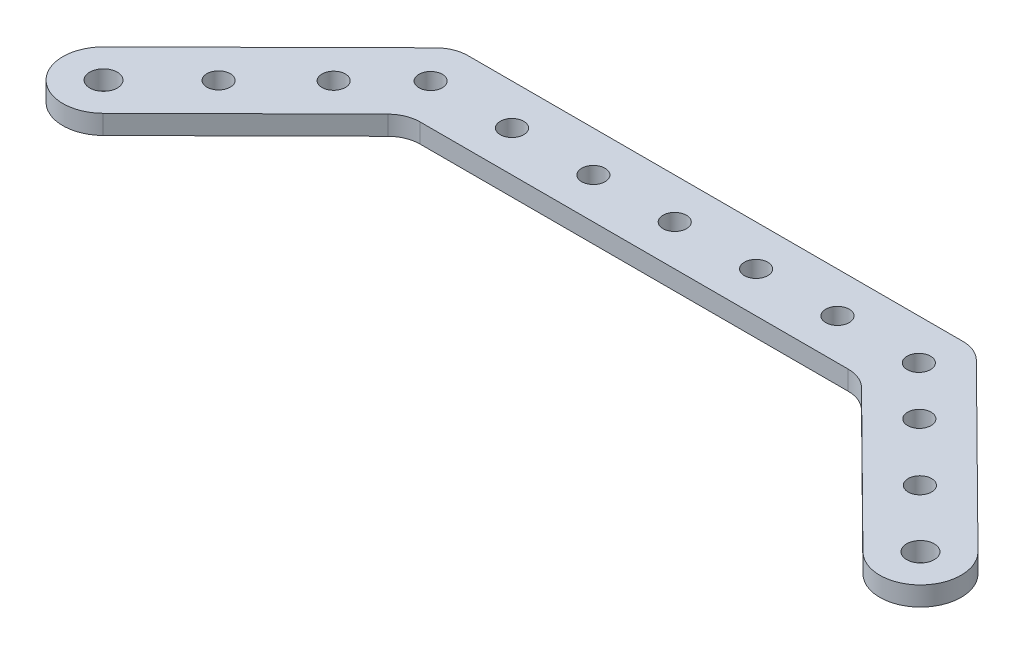
ISO-10303-21;
HEADER;
FILE_DESCRIPTION(('STEP AP214'),'2;1');
FILE_NAME('part.step','',(''),(''),'','','');
FILE_SCHEMA(('AUTOMOTIVE_DESIGN { 1 0 10303 214 1 1 1 1 }'));
ENDSEC;
DATA;
#1=APPLICATION_CONTEXT('core data for automotive mechanical design processes');
#2=APPLICATION_PROTOCOL_DEFINITION('international standard','automotive_design',2000,#1);
#3=PRODUCT_CONTEXT('',#1,'mechanical');
#4=PRODUCT('Part','Part','',(#3));
#5=PRODUCT_RELATED_PRODUCT_CATEGORY('part','',(#4));
#6=PRODUCT_DEFINITION_FORMATION('','',#4);
#7=PRODUCT_DEFINITION_CONTEXT('part definition',#1,'design');
#8=PRODUCT_DEFINITION('design','',#6,#7);
#9=PRODUCT_DEFINITION_SHAPE('','',#8);
#10=(LENGTH_UNIT() NAMED_UNIT(*) SI_UNIT(.MILLI.,.METRE.));
#11=(NAMED_UNIT(*) PLANE_ANGLE_UNIT() SI_UNIT($,.RADIAN.));
#12=(NAMED_UNIT(*) SI_UNIT($,.STERADIAN.) SOLID_ANGLE_UNIT());
#13=UNCERTAINTY_MEASURE_WITH_UNIT(LENGTH_MEASURE(1.E-05),#10,'distance_accuracy_value','');
#14=(GEOMETRIC_REPRESENTATION_CONTEXT(3) GLOBAL_UNCERTAINTY_ASSIGNED_CONTEXT((#13)) GLOBAL_UNIT_ASSIGNED_CONTEXT((#10,
#11,#12)) REPRESENTATION_CONTEXT('',''));
#15=CARTESIAN_POINT('',(0.,0.,0.));
#16=DIRECTION('',(0.,0.,1.));
#17=DIRECTION('',(1.,0.,0.));
#18=AXIS2_PLACEMENT_3D('',#15,#16,#17);
#19=CARTESIAN_POINT('',(70.104,3.,-19.05));
#20=DIRECTION('',(0.,0.,1.));
#21=DIRECTION('',(1.,0.,0.));
#22=AXIS2_PLACEMENT_3D('',#19,#20,#21);
#23=PLANE('',#22);
#24=DIRECTION('',(-1.,0.,0.));
#25=VECTOR('',#24,1.);
#26=CARTESIAN_POINT('',(70.104,0.,-19.05));
#27=LINE('',#26,#25);
#28=CARTESIAN_POINT('',(38.6223538191422,0.,-19.05));
#29=VERTEX_POINT('',#28);
#30=CARTESIAN_POINT('',(-38.6223538191423,0.,-19.05));
#31=VERTEX_POINT('',#30);
#32=EDGE_CURVE('E160',#29,#31,#27,.T.);
#33=ORIENTED_EDGE('',*,*,#32,.T.);
#34=DIRECTION('',(0.,1.,0.));
#35=VECTOR('',#34,1.);
#36=CARTESIAN_POINT('',(-38.6223538191423,3.,-19.05));
#37=LINE('',#36,#35);
#38=CARTESIAN_POINT('',(-38.6223538191423,3.,-19.05));
#39=VERTEX_POINT('',#38);
#40=EDGE_CURVE('E167',#31,#39,#37,.T.);
#41=ORIENTED_EDGE('',*,*,#40,.T.);
#42=DIRECTION('',(-1.,0.,0.));
#43=VECTOR('',#42,1.);
#44=CARTESIAN_POINT('',(70.104,3.,-19.05));
#45=LINE('',#44,#43);
#46=CARTESIAN_POINT('',(38.6223538191422,3.,-19.05));
#47=VERTEX_POINT('',#46);
#48=EDGE_CURVE('E144',#47,#39,#45,.T.);
#49=ORIENTED_EDGE('',*,*,#48,.F.);
#50=DIRECTION('',(0.,1.,0.));
#51=VECTOR('',#50,1.);
#52=CARTESIAN_POINT('',(38.6223538191422,0.,-19.05));
#53=LINE('',#52,#51);
#54=EDGE_CURVE('E165',#47,#29,#53,.F.);
#55=ORIENTED_EDGE('',*,*,#54,.T.);
#56=EDGE_LOOP('',(#33,#41,#49,#55));
#57=FACE_BOUND('',#56,.T.);
#58=ADVANCED_FACE('F35',(#57),#23,.F.);
#59=CARTESIAN_POINT('',(0.,3.,0.));
#60=DIRECTION('',(0.,1.,0.));
#61=DIRECTION('',(0.,0.,1.));
#62=AXIS2_PLACEMENT_3D('',#59,#60,#61);
#63=PLANE('',#62);
#64=CARTESIAN_POINT('',(-54.7291776776711,3.,3.76453235412978));
#65=DIRECTION('',(0.,1.,0.));
#66=DIRECTION('',(0.,0.,1.));
#67=AXIS2_PLACEMENT_3D('',#64,#65,#66);
#68=CIRCLE('',#67,1.82879999999999);
#69=CARTESIAN_POINT('',(-54.7291776776711,3.,5.59333235412977));
#70=VERTEX_POINT('',#69);
#71=EDGE_CURVE('E450',#70,#70,#68,.T.);
#72=ORIENTED_EDGE('',*,*,#71,.F.);
#73=EDGE_LOOP('',(#72));
#74=FACE_BOUND('',#73,.T.);
#75=CARTESIAN_POINT('',(-45.7043553553422,3.,-5.17093529174044));
#76=DIRECTION('',(0.,1.,0.));
#77=DIRECTION('',(0.,0.,1.));
#78=AXIS2_PLACEMENT_3D('',#75,#76,#77);
#79=CIRCLE('',#78,1.82879999999998);
#80=CARTESIAN_POINT('',(-45.7043553553422,3.,-3.34213529174046));
#81=VERTEX_POINT('',#80);
#82=EDGE_CURVE('E446',#81,#81,#79,.T.);
#83=ORIENTED_EDGE('',*,*,#82,.F.);
#84=EDGE_LOOP('',(#83));
#85=FACE_BOUND('',#84,.T.);
#86=CARTESIAN_POINT('',(-38.1,3.,-12.7));
#87=DIRECTION('',(0.,1.,0.));
#88=DIRECTION('',(0.,0.,1.));
#89=AXIS2_PLACEMENT_3D('',#86,#87,#88);
#90=CIRCLE('',#89,1.82879999999998);
#91=CARTESIAN_POINT('',(-38.1,3.,-10.8712));
#92=VERTEX_POINT('',#91);
#93=EDGE_CURVE('E442',#92,#92,#90,.T.);
#94=ORIENTED_EDGE('',*,*,#93,.F.);
#95=EDGE_LOOP('',(#94));
#96=FACE_BOUND('',#95,.T.);
#97=CARTESIAN_POINT('',(0.,3.,-12.7));
#98=DIRECTION('',(0.,1.,0.));
#99=DIRECTION('',(0.,0.,1.));
#100=AXIS2_PLACEMENT_3D('',#97,#98,#99);
#101=CIRCLE('',#100,1.82879999999999);
#102=CARTESIAN_POINT('',(0.,3.,-10.8712));
#103=VERTEX_POINT('',#102);
#104=EDGE_CURVE('E438',#103,#103,#101,.T.);
#105=ORIENTED_EDGE('',*,*,#104,.F.);
#106=EDGE_LOOP('',(#105));
#107=FACE_BOUND('',#106,.T.);
#108=CARTESIAN_POINT('',(38.1,3.,-12.7));
#109=DIRECTION('',(0.,1.,0.));
#110=DIRECTION('',(0.,0.,1.));
#111=AXIS2_PLACEMENT_3D('',#108,#109,#110);
#112=CIRCLE('',#111,1.82879999999998);
#113=CARTESIAN_POINT('',(38.1,3.,-10.8712));
#114=VERTEX_POINT('',#113);
#115=EDGE_CURVE('E434',#114,#114,#112,.T.);
#116=ORIENTED_EDGE('',*,*,#115,.F.);
#117=EDGE_LOOP('',(#116));
#118=FACE_BOUND('',#117,.T.);
#119=CARTESIAN_POINT('',(45.7043553553422,3.,-5.17093529174044));
#120=DIRECTION('',(0.,1.,0.));
#121=DIRECTION('',(0.,0.,1.));
#122=AXIS2_PLACEMENT_3D('',#119,#120,#121);
#123=CIRCLE('',#122,1.82879999999998);
#124=CARTESIAN_POINT('',(45.7043553553422,3.,-3.34213529174046));
#125=VERTEX_POINT('',#124);
#126=EDGE_CURVE('E430',#125,#125,#123,.T.);
#127=ORIENTED_EDGE('',*,*,#126,.F.);
#128=EDGE_LOOP('',(#127));
#129=FACE_BOUND('',#128,.T.);
#130=CARTESIAN_POINT('',(54.7291776776711,3.,3.76453235412978));
#131=DIRECTION('',(0.,1.,0.));
#132=DIRECTION('',(0.,0.,1.));
#133=AXIS2_PLACEMENT_3D('',#130,#131,#132);
#134=CIRCLE('',#133,1.82879999999999);
#135=CARTESIAN_POINT('',(54.7291776776711,3.,5.59333235412977));
#136=VERTEX_POINT('',#135);
#137=EDGE_CURVE('E426',#136,#136,#134,.T.);
#138=ORIENTED_EDGE('',*,*,#137,.F.);
#139=EDGE_LOOP('',(#138));
#140=FACE_BOUND('',#139,.T.);
#141=CARTESIAN_POINT('',(-25.4,3.,-12.7));
#142=DIRECTION('',(0.,1.,0.));
#143=DIRECTION('',(0.,0.,1.));
#144=AXIS2_PLACEMENT_3D('',#141,#142,#143);
#145=CIRCLE('',#144,1.82879999999999);
#146=CARTESIAN_POINT('',(-25.4,3.,-10.8712));
#147=VERTEX_POINT('',#146);
#148=EDGE_CURVE('E422',#147,#147,#145,.T.);
#149=ORIENTED_EDGE('',*,*,#148,.F.);
#150=EDGE_LOOP('',(#149));
#151=FACE_BOUND('',#150,.T.);
#152=CARTESIAN_POINT('',(-12.7,3.,-12.7));
#153=DIRECTION('',(0.,1.,0.));
#154=DIRECTION('',(0.,0.,1.));
#155=AXIS2_PLACEMENT_3D('',#152,#153,#154);
#156=CIRCLE('',#155,1.82879999999999);
#157=CARTESIAN_POINT('',(-12.7,3.,-10.8712));
#158=VERTEX_POINT('',#157);
#159=EDGE_CURVE('E418',#158,#158,#156,.T.);
#160=ORIENTED_EDGE('',*,*,#159,.F.);
#161=EDGE_LOOP('',(#160));
#162=FACE_BOUND('',#161,.T.);
#163=CARTESIAN_POINT('',(12.7,3.,-12.7));
#164=DIRECTION('',(0.,1.,0.));
#165=DIRECTION('',(0.,0.,1.));
#166=AXIS2_PLACEMENT_3D('',#163,#164,#165);
#167=CIRCLE('',#166,1.82879999999999);
#168=CARTESIAN_POINT('',(12.7,3.,-10.8712));
#169=VERTEX_POINT('',#168);
#170=EDGE_CURVE('E414',#169,#169,#167,.T.);
#171=ORIENTED_EDGE('',*,*,#170,.F.);
#172=EDGE_LOOP('',(#171));
#173=FACE_BOUND('',#172,.T.);
#174=CARTESIAN_POINT('',(25.4,3.,-12.7));
#175=DIRECTION('',(0.,1.,0.));
#176=DIRECTION('',(0.,0.,1.));
#177=AXIS2_PLACEMENT_3D('',#174,#175,#176);
#178=CIRCLE('',#177,1.82879999999999);
#179=CARTESIAN_POINT('',(25.4,3.,-10.8712));
#180=VERTEX_POINT('',#179);
#181=EDGE_CURVE('E410',#180,#180,#178,.T.);
#182=ORIENTED_EDGE('',*,*,#181,.F.);
#183=EDGE_LOOP('',(#182));
#184=FACE_BOUND('',#183,.T.);
#185=CARTESIAN_POINT('',(-63.754,3.,12.7));
#186=DIRECTION('',(0.,1.,0.));
#187=DIRECTION('',(0.,0.,1.));
#188=AXIS2_PLACEMENT_3D('',#185,#186,#187);
#189=CIRCLE('',#188,2.15264999999999);
#190=CARTESIAN_POINT('',(-63.754,3.,14.85265));
#191=VERTEX_POINT('',#190);
#192=EDGE_CURVE('E404',#191,#191,#189,.T.);
#193=ORIENTED_EDGE('',*,*,#192,.F.);
#194=EDGE_LOOP('',(#193));
#195=FACE_BOUND('',#194,.T.);
#196=CARTESIAN_POINT('',(63.754,3.,12.7));
#197=DIRECTION('',(0.,1.,0.));
#198=DIRECTION('',(0.,0.,1.));
#199=AXIS2_PLACEMENT_3D('',#196,#197,#198);
#200=CIRCLE('',#199,2.15264999999999);
#201=CARTESIAN_POINT('',(63.754,3.,14.85265));
#202=VERTEX_POINT('',#201);
#203=EDGE_CURVE('E400',#202,#202,#200,.T.);
#204=ORIENTED_EDGE('',*,*,#203,.F.);
#205=EDGE_LOOP('',(#204));
#206=FACE_BOUND('',#205,.T.);
#207=ORIENTED_EDGE('',*,*,#48,.T.);
#208=CARTESIAN_POINT('',(-38.6223538191423,3.,-13.97));
#209=DIRECTION('',(0.,1.,0.));
#210=DIRECTION('',(0.,0.,1.));
#211=AXIS2_PLACEMENT_3D('',#208,#209,#210);
#212=CIRCLE('',#211,5.08);
#213=CARTESIAN_POINT('',(-42.1965408774903,3.,-17.5799289289316));
#214=VERTEX_POINT('',#213);
#215=EDGE_CURVE('E172',#39,#214,#212,.T.);
#216=ORIENTED_EDGE('',*,*,#215,.T.);
#217=DIRECTION('',(-0.710615930892041,0.,0.703580129596081));
#218=VECTOR('',#217,1.);
#219=CARTESIAN_POINT('',(-40.7117690957112,3.,-19.05));
#220=LINE('',#219,#218);
#221=CARTESIAN_POINT('',(-68.2217338229351,3.,8.18758883883555));
#222=VERTEX_POINT('',#221);
#223=EDGE_CURVE('E214',#214,#222,#220,.T.);
#224=ORIENTED_EDGE('',*,*,#223,.T.);
#225=CARTESIAN_POINT('',(-63.754,3.,12.7));
#226=DIRECTION('',(0.,1.,0.));
#227=DIRECTION('',(0.,0.,1.));
#228=AXIS2_PLACEMENT_3D('',#225,#226,#227);
#229=CIRCLE('',#228,6.34999999999999);
#230=CARTESIAN_POINT('',(-59.2862661770649,3.,17.2124111611645));
#231=VERTEX_POINT('',#230);
#232=EDGE_CURVE('E225',#222,#231,#229,.T.);
#233=ORIENTED_EDGE('',*,*,#232,.T.);
#234=DIRECTION('',(0.710615930892041,0.,-0.703580129596081));
#235=VECTOR('',#234,1.);
#236=CARTESIAN_POINT('',(-59.2862661770649,3.,17.2124111611645));
#237=LINE('',#236,#235);
#238=CARTESIAN_POINT('',(-36.9730026860679,3.,-4.87992892893158));
#239=VERTEX_POINT('',#238);
#240=EDGE_CURVE('E201',#231,#239,#237,.T.);
#241=ORIENTED_EDGE('',*,*,#240,.T.);
#242=CARTESIAN_POINT('',(-33.3988156277198,3.,-1.27000000000001));
#243=DIRECTION('',(0.,1.,0.));
#244=DIRECTION('',(0.,0.,1.));
#245=AXIS2_PLACEMENT_3D('',#242,#243,#244);
#246=CIRCLE('',#245,5.08);
#247=CARTESIAN_POINT('',(-33.3988156277198,3.,-6.35000000000001));
#248=VERTEX_POINT('',#247);
#249=EDGE_CURVE('E43',#239,#248,#246,.F.);
#250=ORIENTED_EDGE('',*,*,#249,.T.);
#251=DIRECTION('',(1.,0.,0.));
#252=VECTOR('',#251,1.);
#253=CARTESIAN_POINT('',(-35.4882309042888,3.,-6.35000000000001));
#254=LINE('',#253,#252);
#255=CARTESIAN_POINT('',(33.3988156277198,3.,-6.35000000000001));
#256=VERTEX_POINT('',#255);
#257=EDGE_CURVE('E199',#248,#256,#254,.T.);
#258=ORIENTED_EDGE('',*,*,#257,.T.);
#259=CARTESIAN_POINT('',(33.3988156277198,3.,-1.27000000000001));
#260=DIRECTION('',(0.,1.,0.));
#261=DIRECTION('',(0.,0.,1.));
#262=AXIS2_PLACEMENT_3D('',#259,#260,#261);
#263=CIRCLE('',#262,5.08);
#264=CARTESIAN_POINT('',(36.9730026860679,3.,-4.87992892893158));
#265=VERTEX_POINT('',#264);
#266=EDGE_CURVE('E192',#256,#265,#263,.F.);
#267=ORIENTED_EDGE('',*,*,#266,.T.);
#268=DIRECTION('',(0.710615930892041,0.,0.703580129596081));
#269=VECTOR('',#268,1.);
#270=CARTESIAN_POINT('',(35.4882309042888,3.,-6.35000000000001));
#271=LINE('',#270,#269);
#272=CARTESIAN_POINT('',(59.2862661770649,3.,17.2124111611645));
#273=VERTEX_POINT('',#272);
#274=EDGE_CURVE('E208',#265,#273,#271,.T.);
#275=ORIENTED_EDGE('',*,*,#274,.T.);
#276=CARTESIAN_POINT('',(63.754,3.,12.7));
#277=DIRECTION('',(0.,1.,0.));
#278=DIRECTION('',(0.,0.,-1.));
#279=AXIS2_PLACEMENT_3D('',#276,#277,#278);
#280=CIRCLE('',#279,6.35);
#281=CARTESIAN_POINT('',(68.2217338229351,3.,8.18758883883555));
#282=VERTEX_POINT('',#281);
#283=EDGE_CURVE('E147',#273,#282,#280,.T.);
#284=ORIENTED_EDGE('',*,*,#283,.T.);
#285=DIRECTION('',(-0.710615930892041,0.,-0.703580129596081));
#286=VECTOR('',#285,1.);
#287=CARTESIAN_POINT('',(68.2217338229351,3.,8.18758883883555));
#288=LINE('',#287,#286);
#289=CARTESIAN_POINT('',(42.1965408774903,3.,-17.5799289289316));
#290=VERTEX_POINT('',#289);
#291=EDGE_CURVE('E217',#282,#290,#288,.T.);
#292=ORIENTED_EDGE('',*,*,#291,.T.);
#293=CARTESIAN_POINT('',(38.6223538191422,3.,-13.97));
#294=DIRECTION('',(0.,1.,0.));
#295=DIRECTION('',(0.,0.,1.));
#296=AXIS2_PLACEMENT_3D('',#293,#294,#295);
#297=CIRCLE('',#296,5.08);
#298=EDGE_CURVE('E170',#290,#47,#297,.T.);
#299=ORIENTED_EDGE('',*,*,#298,.T.);
#300=EDGE_LOOP('',(#207,#216,#224,#233,#241,#250,#258,#267,#275,#284,#292,#299));
#301=FACE_BOUND('',#300,.T.);
#302=ADVANCED_FACE('F198',(#74,#85,#96,#107,#118,#129,#140,#151,#162,#173,#184,#195,#206,#301),
#63,.T.);
#303=CARTESIAN_POINT('',(0.,0.,0.));
#304=DIRECTION('',(0.,1.,0.));
#305=DIRECTION('',(0.,0.,1.));
#306=AXIS2_PLACEMENT_3D('',#303,#304,#305);
#307=PLANE('',#306);
#308=CARTESIAN_POINT('',(-54.7291776776711,0.,3.76453235412978));
#309=DIRECTION('',(0.,1.,0.));
#310=DIRECTION('',(0.,0.,1.));
#311=AXIS2_PLACEMENT_3D('',#308,#309,#310);
#312=CIRCLE('',#311,1.8288);
#313=CARTESIAN_POINT('',(-54.7291776776711,0.,5.59333235412978));
#314=VERTEX_POINT('',#313);
#315=EDGE_CURVE('E353',#314,#314,#312,.T.);
#316=ORIENTED_EDGE('',*,*,#315,.T.);
#317=EDGE_LOOP('',(#316));
#318=FACE_BOUND('',#317,.T.);
#319=CARTESIAN_POINT('',(-45.7043553553422,0.,-5.17093529174044));
#320=DIRECTION('',(0.,1.,0.));
#321=DIRECTION('',(0.,0.,1.));
#322=AXIS2_PLACEMENT_3D('',#319,#320,#321);
#323=CIRCLE('',#322,1.8288);
#324=CARTESIAN_POINT('',(-45.7043553553422,0.,-3.34213529174044));
#325=VERTEX_POINT('',#324);
#326=EDGE_CURVE('E357',#325,#325,#323,.T.);
#327=ORIENTED_EDGE('',*,*,#326,.T.);
#328=EDGE_LOOP('',(#327));
#329=FACE_BOUND('',#328,.T.);
#330=CARTESIAN_POINT('',(-38.1,0.,-12.7));
#331=DIRECTION('',(0.,1.,0.));
#332=DIRECTION('',(0.,0.,1.));
#333=AXIS2_PLACEMENT_3D('',#330,#331,#332);
#334=CIRCLE('',#333,1.8288);
#335=CARTESIAN_POINT('',(-38.1,0.,-10.8712));
#336=VERTEX_POINT('',#335);
#337=EDGE_CURVE('E361',#336,#336,#334,.T.);
#338=ORIENTED_EDGE('',*,*,#337,.T.);
#339=EDGE_LOOP('',(#338));
#340=FACE_BOUND('',#339,.T.);
#341=CARTESIAN_POINT('',(0.,0.,-12.7));
#342=DIRECTION('',(0.,1.,0.));
#343=DIRECTION('',(0.,0.,1.));
#344=AXIS2_PLACEMENT_3D('',#341,#342,#343);
#345=CIRCLE('',#344,1.8288);
#346=CARTESIAN_POINT('',(0.,0.,-10.8712));
#347=VERTEX_POINT('',#346);
#348=EDGE_CURVE('E365',#347,#347,#345,.T.);
#349=ORIENTED_EDGE('',*,*,#348,.T.);
#350=EDGE_LOOP('',(#349));
#351=FACE_BOUND('',#350,.T.);
#352=CARTESIAN_POINT('',(38.1,0.,-12.7));
#353=DIRECTION('',(0.,1.,0.));
#354=DIRECTION('',(0.,0.,1.));
#355=AXIS2_PLACEMENT_3D('',#352,#353,#354);
#356=CIRCLE('',#355,1.8288);
#357=CARTESIAN_POINT('',(38.1,0.,-10.8712));
#358=VERTEX_POINT('',#357);
#359=EDGE_CURVE('E369',#358,#358,#356,.T.);
#360=ORIENTED_EDGE('',*,*,#359,.T.);
#361=EDGE_LOOP('',(#360));
#362=FACE_BOUND('',#361,.T.);
#363=CARTESIAN_POINT('',(45.7043553553422,0.,-5.17093529174044));
#364=DIRECTION('',(0.,1.,0.));
#365=DIRECTION('',(0.,0.,1.));
#366=AXIS2_PLACEMENT_3D('',#363,#364,#365);
#367=CIRCLE('',#366,1.8288);
#368=CARTESIAN_POINT('',(45.7043553553422,0.,-3.34213529174044));
#369=VERTEX_POINT('',#368);
#370=EDGE_CURVE('E373',#369,#369,#367,.T.);
#371=ORIENTED_EDGE('',*,*,#370,.T.);
#372=EDGE_LOOP('',(#371));
#373=FACE_BOUND('',#372,.T.);
#374=CARTESIAN_POINT('',(54.7291776776711,0.,3.76453235412978));
#375=DIRECTION('',(0.,1.,0.));
#376=DIRECTION('',(0.,0.,1.));
#377=AXIS2_PLACEMENT_3D('',#374,#375,#376);
#378=CIRCLE('',#377,1.8288);
#379=CARTESIAN_POINT('',(54.7291776776711,0.,5.59333235412978));
#380=VERTEX_POINT('',#379);
#381=EDGE_CURVE('E377',#380,#380,#378,.T.);
#382=ORIENTED_EDGE('',*,*,#381,.T.);
#383=EDGE_LOOP('',(#382));
#384=FACE_BOUND('',#383,.T.);
#385=CARTESIAN_POINT('',(-25.4,0.,-12.7));
#386=DIRECTION('',(0.,1.,0.));
#387=DIRECTION('',(0.,0.,1.));
#388=AXIS2_PLACEMENT_3D('',#385,#386,#387);
#389=CIRCLE('',#388,1.8288);
#390=CARTESIAN_POINT('',(-25.4,0.,-10.8712));
#391=VERTEX_POINT('',#390);
#392=EDGE_CURVE('E381',#391,#391,#389,.T.);
#393=ORIENTED_EDGE('',*,*,#392,.T.);
#394=EDGE_LOOP('',(#393));
#395=FACE_BOUND('',#394,.T.);
#396=CARTESIAN_POINT('',(-12.7,0.,-12.7));
#397=DIRECTION('',(0.,1.,0.));
#398=DIRECTION('',(0.,0.,1.));
#399=AXIS2_PLACEMENT_3D('',#396,#397,#398);
#400=CIRCLE('',#399,1.8288);
#401=CARTESIAN_POINT('',(-12.7,0.,-10.8712));
#402=VERTEX_POINT('',#401);
#403=EDGE_CURVE('E385',#402,#402,#400,.T.);
#404=ORIENTED_EDGE('',*,*,#403,.T.);
#405=EDGE_LOOP('',(#404));
#406=FACE_BOUND('',#405,.T.);
#407=CARTESIAN_POINT('',(12.7,0.,-12.7));
#408=DIRECTION('',(0.,1.,0.));
#409=DIRECTION('',(0.,0.,1.));
#410=AXIS2_PLACEMENT_3D('',#407,#408,#409);
#411=CIRCLE('',#410,1.8288);
#412=CARTESIAN_POINT('',(12.7,0.,-10.8712));
#413=VERTEX_POINT('',#412);
#414=EDGE_CURVE('E389',#413,#413,#411,.T.);
#415=ORIENTED_EDGE('',*,*,#414,.T.);
#416=EDGE_LOOP('',(#415));
#417=FACE_BOUND('',#416,.T.);
#418=CARTESIAN_POINT('',(25.4,0.,-12.7));
#419=DIRECTION('',(0.,1.,0.));
#420=DIRECTION('',(0.,0.,1.));
#421=AXIS2_PLACEMENT_3D('',#418,#419,#420);
#422=CIRCLE('',#421,1.8288);
#423=CARTESIAN_POINT('',(25.4,0.,-10.8712));
#424=VERTEX_POINT('',#423);
#425=EDGE_CURVE('E393',#424,#424,#422,.T.);
#426=ORIENTED_EDGE('',*,*,#425,.T.);
#427=EDGE_LOOP('',(#426));
#428=FACE_BOUND('',#427,.T.);
#429=CARTESIAN_POINT('',(-63.754,0.,12.7));
#430=DIRECTION('',(0.,1.,0.));
#431=DIRECTION('',(0.,0.,1.));
#432=AXIS2_PLACEMENT_3D('',#429,#430,#431);
#433=CIRCLE('',#432,2.15265);
#434=CARTESIAN_POINT('',(-63.754,0.,14.85265));
#435=VERTEX_POINT('',#434);
#436=EDGE_CURVE('E397',#435,#435,#433,.T.);
#437=ORIENTED_EDGE('',*,*,#436,.T.);
#438=EDGE_LOOP('',(#437));
#439=FACE_BOUND('',#438,.T.);
#440=CARTESIAN_POINT('',(63.754,0.,12.7));
#441=DIRECTION('',(0.,1.,0.));
#442=DIRECTION('',(0.,0.,1.));
#443=AXIS2_PLACEMENT_3D('',#440,#441,#442);
#444=CIRCLE('',#443,2.15265000000001);
#445=CARTESIAN_POINT('',(63.754,0.,14.85265));
#446=VERTEX_POINT('',#445);
#447=EDGE_CURVE('E220',#446,#446,#444,.T.);
#448=ORIENTED_EDGE('',*,*,#447,.T.);
#449=EDGE_LOOP('',(#448));
#450=FACE_BOUND('',#449,.T.);
#451=DIRECTION('',(-0.710615930892041,0.,0.703580129596081));
#452=VECTOR('',#451,1.);
#453=CARTESIAN_POINT('',(-40.7117690957112,0.,-19.05));
#454=LINE('',#453,#452);
#455=CARTESIAN_POINT('',(-42.1965408774903,0.,-17.5799289289316));
#456=VERTEX_POINT('',#455);
#457=CARTESIAN_POINT('',(-68.2217338229351,0.,8.18758883883555));
#458=VERTEX_POINT('',#457);
#459=EDGE_CURVE('E154',#456,#458,#454,.T.);
#460=ORIENTED_EDGE('',*,*,#459,.F.);
#461=CARTESIAN_POINT('',(-38.6223538191423,0.,-13.97));
#462=DIRECTION('',(0.,1.,0.));
#463=DIRECTION('',(0.,0.,1.));
#464=AXIS2_PLACEMENT_3D('',#461,#462,#463);
#465=CIRCLE('',#464,5.08);
#466=EDGE_CURVE('E178',#456,#31,#465,.F.);
#467=ORIENTED_EDGE('',*,*,#466,.T.);
#468=ORIENTED_EDGE('',*,*,#32,.F.);
#469=CARTESIAN_POINT('',(38.6223538191422,0.,-13.97));
#470=DIRECTION('',(0.,1.,0.));
#471=DIRECTION('',(0.,0.,1.));
#472=AXIS2_PLACEMENT_3D('',#469,#470,#471);
#473=CIRCLE('',#472,5.08);
#474=CARTESIAN_POINT('',(42.1965408774903,0.,-17.5799289289316));
#475=VERTEX_POINT('',#474);
#476=EDGE_CURVE('E176',#29,#475,#473,.F.);
#477=ORIENTED_EDGE('',*,*,#476,.T.);
#478=DIRECTION('',(-0.710615930892041,0.,-0.703580129596081));
#479=VECTOR('',#478,1.);
#480=CARTESIAN_POINT('',(68.2217338229351,0.,8.18758883883555));
#481=LINE('',#480,#479);
#482=CARTESIAN_POINT('',(68.2217338229351,0.,8.18758883883555));
#483=VERTEX_POINT('',#482);
#484=EDGE_CURVE('E132',#483,#475,#481,.T.);
#485=ORIENTED_EDGE('',*,*,#484,.F.);
#486=CARTESIAN_POINT('',(63.754,0.,12.7));
#487=DIRECTION('',(0.,1.,0.));
#488=DIRECTION('',(0.,0.,1.));
#489=AXIS2_PLACEMENT_3D('',#486,#487,#488);
#490=CIRCLE('',#489,6.35);
#491=CARTESIAN_POINT('',(59.2862661770649,0.,17.2124111611645));
#492=VERTEX_POINT('',#491);
#493=EDGE_CURVE('E136',#492,#483,#490,.T.);
#494=ORIENTED_EDGE('',*,*,#493,.F.);
#495=DIRECTION('',(0.710615930892041,0.,0.703580129596081));
#496=VECTOR('',#495,1.);
#497=CARTESIAN_POINT('',(35.4882309042888,0.,-6.35000000000001));
#498=LINE('',#497,#496);
#499=CARTESIAN_POINT('',(36.9730026860679,0.,-4.87992892893158));
#500=VERTEX_POINT('',#499);
#501=EDGE_CURVE('E123',#500,#492,#498,.T.);
#502=ORIENTED_EDGE('',*,*,#501,.F.);
#503=CARTESIAN_POINT('',(33.3988156277198,0.,-1.27000000000001));
#504=DIRECTION('',(0.,1.,0.));
#505=DIRECTION('',(0.,0.,1.));
#506=AXIS2_PLACEMENT_3D('',#503,#504,#505);
#507=CIRCLE('',#506,5.08);
#508=CARTESIAN_POINT('',(33.3988156277198,0.,-6.35000000000001));
#509=VERTEX_POINT('',#508);
#510=EDGE_CURVE('E54',#500,#509,#507,.T.);
#511=ORIENTED_EDGE('',*,*,#510,.T.);
#512=DIRECTION('',(1.,0.,0.));
#513=VECTOR('',#512,1.);
#514=CARTESIAN_POINT('',(-35.4882309042888,0.,-6.35000000000001));
#515=LINE('',#514,#513);
#516=CARTESIAN_POINT('',(-33.3988156277198,0.,-6.35000000000001));
#517=VERTEX_POINT('',#516);
#518=EDGE_CURVE('E133',#517,#509,#515,.T.);
#519=ORIENTED_EDGE('',*,*,#518,.F.);
#520=CARTESIAN_POINT('',(-33.3988156277198,0.,-1.27000000000001));
#521=DIRECTION('',(0.,1.,0.));
#522=DIRECTION('',(0.,0.,1.));
#523=AXIS2_PLACEMENT_3D('',#520,#521,#522);
#524=CIRCLE('',#523,5.08);
#525=CARTESIAN_POINT('',(-36.9730026860679,0.,-4.87992892893158));
#526=VERTEX_POINT('',#525);
#527=EDGE_CURVE('E12',#517,#526,#524,.T.);
#528=ORIENTED_EDGE('',*,*,#527,.T.);
#529=DIRECTION('',(0.710615930892041,0.,-0.703580129596081));
#530=VECTOR('',#529,1.);
#531=CARTESIAN_POINT('',(-59.2862661770649,0.,17.2124111611645));
#532=LINE('',#531,#530);
#533=CARTESIAN_POINT('',(-59.2862661770649,0.,17.2124111611645));
#534=VERTEX_POINT('',#533);
#535=EDGE_CURVE('E212',#534,#526,#532,.T.);
#536=ORIENTED_EDGE('',*,*,#535,.F.);
#537=CARTESIAN_POINT('',(-63.754,0.,12.7));
#538=DIRECTION('',(0.,1.,0.));
#539=DIRECTION('',(0.,0.,1.));
#540=AXIS2_PLACEMENT_3D('',#537,#538,#539);
#541=CIRCLE('',#540,6.34999999999999);
#542=EDGE_CURVE('E143',#458,#534,#541,.T.);
#543=ORIENTED_EDGE('',*,*,#542,.F.);
#544=EDGE_LOOP('',(#460,#467,#468,#477,#485,#494,#502,#511,#519,#528,#536,#543));
#545=FACE_BOUND('',#544,.T.);
#546=ADVANCED_FACE('F138',(#318,#329,#340,#351,#362,#373,#384,#395,#406,#417,#428,#439,#450,
#545),#307,.F.);
#547=CARTESIAN_POINT('',(-63.754,0.,12.7));
#548=DIRECTION('',(0.,1.,0.));
#549=DIRECTION('',(0.,0.,1.));
#550=AXIS2_PLACEMENT_3D('',#547,#548,#549);
#551=CYLINDRICAL_SURFACE('',#550,6.34999999999999);
#552=DIRECTION('',(0.,1.,0.));
#553=VECTOR('',#552,1.);
#554=CARTESIAN_POINT('',(-68.2217338229351,0.,8.18758883883555));
#555=LINE('',#554,#553);
#556=EDGE_CURVE('E151',#458,#222,#555,.T.);
#557=ORIENTED_EDGE('',*,*,#556,.F.);
#558=ORIENTED_EDGE('',*,*,#542,.T.);
#559=DIRECTION('',(0.,1.,0.));
#560=VECTOR('',#559,1.);
#561=CARTESIAN_POINT('',(-59.2862661770649,0.,17.2124111611645));
#562=LINE('',#561,#560);
#563=EDGE_CURVE('E149',#534,#231,#562,.T.);
#564=ORIENTED_EDGE('',*,*,#563,.T.);
#565=ORIENTED_EDGE('',*,*,#232,.F.);
#566=EDGE_LOOP('',(#557,#558,#564,#565));
#567=FACE_BOUND('',#566,.T.);
#568=ADVANCED_FACE('F239',(#567),#551,.T.);
#569=CARTESIAN_POINT('',(63.754,0.,12.7));
#570=DIRECTION('',(0.,1.,0.));
#571=DIRECTION('',(0.,0.,1.));
#572=AXIS2_PLACEMENT_3D('',#569,#570,#571);
#573=CYLINDRICAL_SURFACE('',#572,6.35);
#574=DIRECTION('',(0.,1.,0.));
#575=VECTOR('',#574,1.);
#576=CARTESIAN_POINT('',(59.2862661770649,0.,17.2124111611645));
#577=LINE('',#576,#575);
#578=EDGE_CURVE('E128',#492,#273,#577,.T.);
#579=ORIENTED_EDGE('',*,*,#578,.F.);
#580=ORIENTED_EDGE('',*,*,#493,.T.);
#581=DIRECTION('',(0.,1.,0.));
#582=VECTOR('',#581,1.);
#583=CARTESIAN_POINT('',(68.2217338229351,0.,8.18758883883555));
#584=LINE('',#583,#582);
#585=EDGE_CURVE('E148',#483,#282,#584,.T.);
#586=ORIENTED_EDGE('',*,*,#585,.T.);
#587=ORIENTED_EDGE('',*,*,#283,.F.);
#588=EDGE_LOOP('',(#579,#580,#586,#587));
#589=FACE_BOUND('',#588,.T.);
#590=ADVANCED_FACE('F146',(#589),#573,.T.);
#591=CARTESIAN_POINT('',(-40.7117690957112,0.,-19.05));
#592=DIRECTION('',(-0.703580129596081,0.,-0.710615930892041));
#593=DIRECTION('',(-0.710615930892041,0.,0.703580129596081));
#594=AXIS2_PLACEMENT_3D('',#591,#592,#593);
#595=PLANE('',#594);
#596=ORIENTED_EDGE('',*,*,#223,.F.);
#597=DIRECTION('',(0.,1.,0.));
#598=VECTOR('',#597,1.);
#599=CARTESIAN_POINT('',(-42.1965408774903,0.,-17.5799289289316));
#600=LINE('',#599,#598);
#601=EDGE_CURVE('E174',#214,#456,#600,.F.);
#602=ORIENTED_EDGE('',*,*,#601,.T.);
#603=ORIENTED_EDGE('',*,*,#459,.T.);
#604=ORIENTED_EDGE('',*,*,#556,.T.);
#605=EDGE_LOOP('',(#596,#602,#603,#604));
#606=FACE_BOUND('',#605,.T.);
#607=ADVANCED_FACE('F236',(#606),#595,.T.);
#608=CARTESIAN_POINT('',(68.2217338229351,0.,8.18758883883555));
#609=DIRECTION('',(0.703580129596081,0.,-0.710615930892041));
#610=DIRECTION('',(-0.710615930892041,0.,-0.703580129596081));
#611=AXIS2_PLACEMENT_3D('',#608,#609,#610);
#612=PLANE('',#611);
#613=ORIENTED_EDGE('',*,*,#484,.T.);
#614=DIRECTION('',(0.,1.,0.));
#615=VECTOR('',#614,1.);
#616=CARTESIAN_POINT('',(42.1965408774903,3.,-17.5799289289316));
#617=LINE('',#616,#615);
#618=EDGE_CURVE('E180',#475,#290,#617,.T.);
#619=ORIENTED_EDGE('',*,*,#618,.T.);
#620=ORIENTED_EDGE('',*,*,#291,.F.);
#621=ORIENTED_EDGE('',*,*,#585,.F.);
#622=EDGE_LOOP('',(#613,#619,#620,#621));
#623=FACE_BOUND('',#622,.T.);
#624=ADVANCED_FACE('F254',(#623),#612,.T.);
#625=CARTESIAN_POINT('',(35.4882309042888,0.,-6.35000000000001));
#626=DIRECTION('',(-0.703580129596081,0.,0.710615930892041));
#627=DIRECTION('',(0.710615930892041,0.,0.703580129596081));
#628=AXIS2_PLACEMENT_3D('',#625,#626,#627);
#629=PLANE('',#628);
#630=ORIENTED_EDGE('',*,*,#274,.F.);
#631=DIRECTION('',(0.,1.,0.));
#632=VECTOR('',#631,1.);
#633=CARTESIAN_POINT('',(36.9730026860679,0.,-4.87992892893158));
#634=LINE('',#633,#632);
#635=EDGE_CURVE('E131',#265,#500,#634,.F.);
#636=ORIENTED_EDGE('',*,*,#635,.T.);
#637=ORIENTED_EDGE('',*,*,#501,.T.);
#638=ORIENTED_EDGE('',*,*,#578,.T.);
#639=EDGE_LOOP('',(#630,#636,#637,#638));
#640=FACE_BOUND('',#639,.T.);
#641=ADVANCED_FACE('F126',(#640),#629,.T.);
#642=CARTESIAN_POINT('',(-35.4882309042888,0.,-6.35000000000001));
#643=DIRECTION('',(0.,0.,1.));
#644=DIRECTION('',(1.,0.,0.));
#645=AXIS2_PLACEMENT_3D('',#642,#643,#644);
#646=PLANE('',#645);
#647=ORIENTED_EDGE('',*,*,#518,.T.);
#648=DIRECTION('',(0.,1.,0.));
#649=VECTOR('',#648,1.);
#650=CARTESIAN_POINT('',(33.3988156277198,3.,-6.35000000000001));
#651=LINE('',#650,#649);
#652=EDGE_CURVE('E185',#509,#256,#651,.T.);
#653=ORIENTED_EDGE('',*,*,#652,.T.);
#654=ORIENTED_EDGE('',*,*,#257,.F.);
#655=DIRECTION('',(0.,1.,0.));
#656=VECTOR('',#655,1.);
#657=CARTESIAN_POINT('',(-33.3988156277198,0.,-6.35000000000001));
#658=LINE('',#657,#656);
#659=EDGE_CURVE('E183',#248,#517,#658,.F.);
#660=ORIENTED_EDGE('',*,*,#659,.T.);
#661=EDGE_LOOP('',(#647,#653,#654,#660));
#662=FACE_BOUND('',#661,.T.);
#663=ADVANCED_FACE('F206',(#662),#646,.T.);
#664=CARTESIAN_POINT('',(-59.2862661770649,0.,17.2124111611645));
#665=DIRECTION('',(0.703580129596081,0.,0.710615930892041));
#666=DIRECTION('',(0.710615930892041,0.,-0.703580129596081));
#667=AXIS2_PLACEMENT_3D('',#664,#665,#666);
#668=PLANE('',#667);
#669=ORIENTED_EDGE('',*,*,#535,.T.);
#670=DIRECTION('',(0.,1.,0.));
#671=VECTOR('',#670,1.);
#672=CARTESIAN_POINT('',(-36.9730026860679,3.,-4.87992892893158));
#673=LINE('',#672,#671);
#674=EDGE_CURVE('E189',#526,#239,#673,.T.);
#675=ORIENTED_EDGE('',*,*,#674,.T.);
#676=ORIENTED_EDGE('',*,*,#240,.F.);
#677=ORIENTED_EDGE('',*,*,#563,.F.);
#678=EDGE_LOOP('',(#669,#675,#676,#677));
#679=FACE_BOUND('',#678,.T.);
#680=ADVANCED_FACE('F211',(#679),#668,.T.);
#681=CARTESIAN_POINT('',(63.754,3.,12.7));
#682=DIRECTION('',(0.,1.,0.));
#683=DIRECTION('',(0.,0.,1.));
#684=AXIS2_PLACEMENT_3D('',#681,#682,#683);
#685=CYLINDRICAL_SURFACE('',#684,2.15265);
#686=ORIENTED_EDGE('',*,*,#447,.F.);
#687=EDGE_LOOP('',(#686));
#688=FACE_BOUND('',#687,.T.);
#689=ORIENTED_EDGE('',*,*,#203,.T.);
#690=EDGE_LOOP('',(#689));
#691=FACE_BOUND('',#690,.T.);
#692=ADVANCED_FACE('F327',(#688,#691),#685,.F.);
#693=CARTESIAN_POINT('',(-63.754,3.,12.7));
#694=DIRECTION('',(0.,1.,0.));
#695=DIRECTION('',(0.,0.,1.));
#696=AXIS2_PLACEMENT_3D('',#693,#694,#695);
#697=CYLINDRICAL_SURFACE('',#696,2.15265);
#698=ORIENTED_EDGE('',*,*,#436,.F.);
#699=EDGE_LOOP('',(#698));
#700=FACE_BOUND('',#699,.T.);
#701=ORIENTED_EDGE('',*,*,#192,.T.);
#702=EDGE_LOOP('',(#701));
#703=FACE_BOUND('',#702,.T.);
#704=ADVANCED_FACE('F323',(#700,#703),#697,.F.);
#705=CARTESIAN_POINT('',(25.4,3.,-12.7));
#706=DIRECTION('',(0.,1.,0.));
#707=DIRECTION('',(0.,0.,1.));
#708=AXIS2_PLACEMENT_3D('',#705,#706,#707);
#709=CYLINDRICAL_SURFACE('',#708,1.82879999999999);
#710=ORIENTED_EDGE('',*,*,#425,.F.);
#711=EDGE_LOOP('',(#710));
#712=FACE_BOUND('',#711,.T.);
#713=ORIENTED_EDGE('',*,*,#181,.T.);
#714=EDGE_LOOP('',(#713));
#715=FACE_BOUND('',#714,.T.);
#716=ADVANCED_FACE('F319',(#712,#715),#709,.F.);
#717=CARTESIAN_POINT('',(12.7,3.,-12.7));
#718=DIRECTION('',(0.,1.,0.));
#719=DIRECTION('',(0.,0.,1.));
#720=AXIS2_PLACEMENT_3D('',#717,#718,#719);
#721=CYLINDRICAL_SURFACE('',#720,1.82879999999999);
#722=ORIENTED_EDGE('',*,*,#414,.F.);
#723=EDGE_LOOP('',(#722));
#724=FACE_BOUND('',#723,.T.);
#725=ORIENTED_EDGE('',*,*,#170,.T.);
#726=EDGE_LOOP('',(#725));
#727=FACE_BOUND('',#726,.T.);
#728=ADVANCED_FACE('F315',(#724,#727),#721,.F.);
#729=CARTESIAN_POINT('',(-12.7,3.,-12.7));
#730=DIRECTION('',(0.,1.,0.));
#731=DIRECTION('',(0.,0.,1.));
#732=AXIS2_PLACEMENT_3D('',#729,#730,#731);
#733=CYLINDRICAL_SURFACE('',#732,1.82879999999999);
#734=ORIENTED_EDGE('',*,*,#403,.F.);
#735=EDGE_LOOP('',(#734));
#736=FACE_BOUND('',#735,.T.);
#737=ORIENTED_EDGE('',*,*,#159,.T.);
#738=EDGE_LOOP('',(#737));
#739=FACE_BOUND('',#738,.T.);
#740=ADVANCED_FACE('F311',(#736,#739),#733,.F.);
#741=CARTESIAN_POINT('',(-25.4,3.,-12.7));
#742=DIRECTION('',(0.,1.,0.));
#743=DIRECTION('',(0.,0.,1.));
#744=AXIS2_PLACEMENT_3D('',#741,#742,#743);
#745=CYLINDRICAL_SURFACE('',#744,1.82879999999999);
#746=ORIENTED_EDGE('',*,*,#392,.F.);
#747=EDGE_LOOP('',(#746));
#748=FACE_BOUND('',#747,.T.);
#749=ORIENTED_EDGE('',*,*,#148,.T.);
#750=EDGE_LOOP('',(#749));
#751=FACE_BOUND('',#750,.T.);
#752=ADVANCED_FACE('F307',(#748,#751),#745,.F.);
#753=CARTESIAN_POINT('',(54.7291776776711,3.,3.76453235412978));
#754=DIRECTION('',(0.,1.,0.));
#755=DIRECTION('',(0.,0.,1.));
#756=AXIS2_PLACEMENT_3D('',#753,#754,#755);
#757=CYLINDRICAL_SURFACE('',#756,1.8288);
#758=ORIENTED_EDGE('',*,*,#381,.F.);
#759=EDGE_LOOP('',(#758));
#760=FACE_BOUND('',#759,.T.);
#761=ORIENTED_EDGE('',*,*,#137,.T.);
#762=EDGE_LOOP('',(#761));
#763=FACE_BOUND('',#762,.T.);
#764=ADVANCED_FACE('F303',(#760,#763),#757,.F.);
#765=CARTESIAN_POINT('',(45.7043553553422,3.,-5.17093529174044));
#766=DIRECTION('',(0.,1.,0.));
#767=DIRECTION('',(0.,0.,1.));
#768=AXIS2_PLACEMENT_3D('',#765,#766,#767);
#769=CYLINDRICAL_SURFACE('',#768,1.82879999999999);
#770=ORIENTED_EDGE('',*,*,#370,.F.);
#771=EDGE_LOOP('',(#770));
#772=FACE_BOUND('',#771,.T.);
#773=ORIENTED_EDGE('',*,*,#126,.T.);
#774=EDGE_LOOP('',(#773));
#775=FACE_BOUND('',#774,.T.);
#776=ADVANCED_FACE('F299',(#772,#775),#769,.F.);
#777=CARTESIAN_POINT('',(38.1,3.,-12.7));
#778=DIRECTION('',(0.,1.,0.));
#779=DIRECTION('',(0.,0.,1.));
#780=AXIS2_PLACEMENT_3D('',#777,#778,#779);
#781=CYLINDRICAL_SURFACE('',#780,1.82879999999999);
#782=ORIENTED_EDGE('',*,*,#359,.F.);
#783=EDGE_LOOP('',(#782));
#784=FACE_BOUND('',#783,.T.);
#785=ORIENTED_EDGE('',*,*,#115,.T.);
#786=EDGE_LOOP('',(#785));
#787=FACE_BOUND('',#786,.T.);
#788=ADVANCED_FACE('F295',(#784,#787),#781,.F.);
#789=CARTESIAN_POINT('',(0.,3.,-12.7));
#790=DIRECTION('',(0.,1.,0.));
#791=DIRECTION('',(0.,0.,1.));
#792=AXIS2_PLACEMENT_3D('',#789,#790,#791);
#793=CYLINDRICAL_SURFACE('',#792,1.82879999999999);
#794=ORIENTED_EDGE('',*,*,#348,.F.);
#795=EDGE_LOOP('',(#794));
#796=FACE_BOUND('',#795,.T.);
#797=ORIENTED_EDGE('',*,*,#104,.T.);
#798=EDGE_LOOP('',(#797));
#799=FACE_BOUND('',#798,.T.);
#800=ADVANCED_FACE('F291',(#796,#799),#793,.F.);
#801=CARTESIAN_POINT('',(-38.1,3.,-12.7));
#802=DIRECTION('',(0.,1.,0.));
#803=DIRECTION('',(0.,0.,1.));
#804=AXIS2_PLACEMENT_3D('',#801,#802,#803);
#805=CYLINDRICAL_SURFACE('',#804,1.82879999999999);
#806=ORIENTED_EDGE('',*,*,#337,.F.);
#807=EDGE_LOOP('',(#806));
#808=FACE_BOUND('',#807,.T.);
#809=ORIENTED_EDGE('',*,*,#93,.T.);
#810=EDGE_LOOP('',(#809));
#811=FACE_BOUND('',#810,.T.);
#812=ADVANCED_FACE('F283',(#808,#811),#805,.F.);
#813=CARTESIAN_POINT('',(-45.7043553553422,3.,-5.17093529174044));
#814=DIRECTION('',(0.,1.,0.));
#815=DIRECTION('',(0.,0.,1.));
#816=AXIS2_PLACEMENT_3D('',#813,#814,#815);
#817=CYLINDRICAL_SURFACE('',#816,1.82879999999999);
#818=ORIENTED_EDGE('',*,*,#326,.F.);
#819=EDGE_LOOP('',(#818));
#820=FACE_BOUND('',#819,.T.);
#821=ORIENTED_EDGE('',*,*,#82,.T.);
#822=EDGE_LOOP('',(#821));
#823=FACE_BOUND('',#822,.T.);
#824=ADVANCED_FACE('F277',(#820,#823),#817,.F.);
#825=CARTESIAN_POINT('',(-54.7291776776711,3.,3.76453235412978));
#826=DIRECTION('',(0.,1.,0.));
#827=DIRECTION('',(0.,0.,1.));
#828=AXIS2_PLACEMENT_3D('',#825,#826,#827);
#829=CYLINDRICAL_SURFACE('',#828,1.8288);
#830=ORIENTED_EDGE('',*,*,#315,.F.);
#831=EDGE_LOOP('',(#830));
#832=FACE_BOUND('',#831,.T.);
#833=ORIENTED_EDGE('',*,*,#71,.T.);
#834=EDGE_LOOP('',(#833));
#835=FACE_BOUND('',#834,.T.);
#836=ADVANCED_FACE('F273',(#832,#835),#829,.F.);
#837=CARTESIAN_POINT('',(-38.6223538191423,3.,-13.97));
#838=DIRECTION('',(0.,-1.,0.));
#839=DIRECTION('',(0.,0.,-1.));
#840=AXIS2_PLACEMENT_3D('',#837,#838,#839);
#841=CYLINDRICAL_SURFACE('',#840,5.08);
#842=ORIENTED_EDGE('',*,*,#466,.F.);
#843=ORIENTED_EDGE('',*,*,#601,.F.);
#844=ORIENTED_EDGE('',*,*,#215,.F.);
#845=ORIENTED_EDGE('',*,*,#40,.F.);
#846=EDGE_LOOP('',(#842,#843,#844,#845));
#847=FACE_BOUND('',#846,.T.);
#848=ADVANCED_FACE('F244',(#847),#841,.T.);
#849=CARTESIAN_POINT('',(38.6223538191422,0.,-13.97));
#850=DIRECTION('',(0.,-1.,0.));
#851=DIRECTION('',(0.,0.,-1.));
#852=AXIS2_PLACEMENT_3D('',#849,#850,#851);
#853=CYLINDRICAL_SURFACE('',#852,5.08);
#854=ORIENTED_EDGE('',*,*,#476,.F.);
#855=ORIENTED_EDGE('',*,*,#54,.F.);
#856=ORIENTED_EDGE('',*,*,#298,.F.);
#857=ORIENTED_EDGE('',*,*,#618,.F.);
#858=EDGE_LOOP('',(#854,#855,#856,#857));
#859=FACE_BOUND('',#858,.T.);
#860=ADVANCED_FACE('F251',(#859),#853,.T.);
#861=CARTESIAN_POINT('',(33.3988156277198,0.,-1.27000000000001));
#862=DIRECTION('',(0.,-1.,0.));
#863=DIRECTION('',(0.,0.,-1.));
#864=AXIS2_PLACEMENT_3D('',#861,#862,#863);
#865=CYLINDRICAL_SURFACE('',#864,5.08);
#866=ORIENTED_EDGE('',*,*,#510,.F.);
#867=ORIENTED_EDGE('',*,*,#635,.F.);
#868=ORIENTED_EDGE('',*,*,#266,.F.);
#869=ORIENTED_EDGE('',*,*,#652,.F.);
#870=EDGE_LOOP('',(#866,#867,#868,#869));
#871=FACE_BOUND('',#870,.T.);
#872=ADVANCED_FACE('F256',(#871),#865,.F.);
#873=CARTESIAN_POINT('',(-33.3988156277198,0.,-1.27000000000001));
#874=DIRECTION('',(0.,-1.,0.));
#875=DIRECTION('',(0.,0.,-1.));
#876=AXIS2_PLACEMENT_3D('',#873,#874,#875);
#877=CYLINDRICAL_SURFACE('',#876,5.08);
#878=ORIENTED_EDGE('',*,*,#527,.F.);
#879=ORIENTED_EDGE('',*,*,#659,.F.);
#880=ORIENTED_EDGE('',*,*,#249,.F.);
#881=ORIENTED_EDGE('',*,*,#674,.F.);
#882=EDGE_LOOP('',(#878,#879,#880,#881));
#883=FACE_BOUND('',#882,.T.);
#884=ADVANCED_FACE('F37',(#883),#877,.F.);
#885=CLOSED_SHELL('',(#58,#302,#546,#568,#590,#607,#624,#641,#663,#680,#692,#704,#716,#728,#740,
#752,#764,#776,#788,#800,#812,#824,#836,#848,#860,#872,#884));
#886=MANIFOLD_SOLID_BREP('B2',#885);
#887=ADVANCED_BREP_SHAPE_REPRESENTATION('',(#18,#886),#14);
#888=SHAPE_DEFINITION_REPRESENTATION(#9,#887);
ENDSEC;
END-ISO-10303-21;
